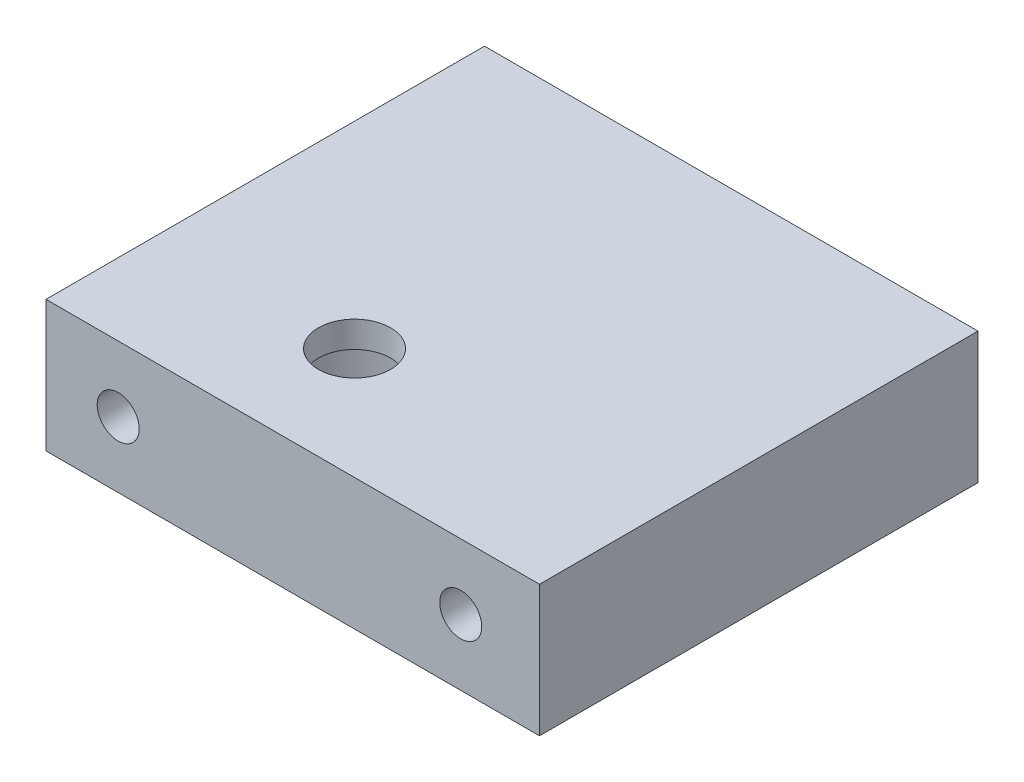
ISO-10303-21;
HEADER;
FILE_DESCRIPTION(('STEP AP214'),'2;1');
FILE_NAME('part.step','',(''),(''),'','','');
FILE_SCHEMA(('AUTOMOTIVE_DESIGN { 1 0 10303 214 1 1 1 1 }'));
ENDSEC;
DATA;
#1=APPLICATION_CONTEXT('core data for automotive mechanical design processes');
#2=APPLICATION_PROTOCOL_DEFINITION('international standard','automotive_design',2000,#1);
#3=PRODUCT_CONTEXT('',#1,'mechanical');
#4=PRODUCT('Part','Part','',(#3));
#5=PRODUCT_RELATED_PRODUCT_CATEGORY('part','',(#4));
#6=PRODUCT_DEFINITION_FORMATION('','',#4);
#7=PRODUCT_DEFINITION_CONTEXT('part definition',#1,'design');
#8=PRODUCT_DEFINITION('design','',#6,#7);
#9=PRODUCT_DEFINITION_SHAPE('','',#8);
#10=(LENGTH_UNIT() NAMED_UNIT(*) SI_UNIT(.MILLI.,.METRE.));
#11=(NAMED_UNIT(*) PLANE_ANGLE_UNIT() SI_UNIT($,.RADIAN.));
#12=(NAMED_UNIT(*) SI_UNIT($,.STERADIAN.) SOLID_ANGLE_UNIT());
#13=UNCERTAINTY_MEASURE_WITH_UNIT(LENGTH_MEASURE(1.E-05),#10,'distance_accuracy_value','');
#14=(GEOMETRIC_REPRESENTATION_CONTEXT(3) GLOBAL_UNCERTAINTY_ASSIGNED_CONTEXT((#13)) GLOBAL_UNIT_ASSIGNED_CONTEXT((#10,
#11,#12)) REPRESENTATION_CONTEXT('',''));
#15=CARTESIAN_POINT('',(0.,0.,0.));
#16=DIRECTION('',(0.,0.,1.));
#17=DIRECTION('',(1.,0.,0.));
#18=AXIS2_PLACEMENT_3D('',#15,#16,#17);
#19=CARTESIAN_POINT('',(6.21136709620178,25.5842182205965,24.9));
#20=DIRECTION('',(0.,-1.,0.));
#21=DIRECTION('',(0.,0.,1.));
#22=AXIS2_PLACEMENT_3D('',#19,#20,#21);
#23=CYLINDRICAL_SURFACE('',#22,6.5);
#24=CARTESIAN_POINT('',(6.21136709620178,15.5842182205965,24.9));
#25=DIRECTION('',(0.,1.,0.));
#26=DIRECTION('',(0.,0.,1.));
#27=AXIS2_PLACEMENT_3D('',#24,#25,#26);
#28=CIRCLE('',#27,6.5);
#29=CARTESIAN_POINT('',(6.21136709620178,15.5842182205965,31.4));
#30=VERTEX_POINT('',#29);
#31=EDGE_CURVE('E113',#30,#30,#28,.T.);
#32=ORIENTED_EDGE('',*,*,#31,.F.);
#33=EDGE_LOOP('',(#32));
#34=FACE_BOUND('',#33,.T.);
#35=CARTESIAN_POINT('',(6.21136709620178,23.5842182205965,24.9));
#36=DIRECTION('',(0.,-1.,0.));
#37=DIRECTION('',(0.,0.,-1.));
#38=AXIS2_PLACEMENT_3D('',#35,#36,#37);
#39=CIRCLE('',#38,6.5);
#40=CARTESIAN_POINT('',(6.21136709620178,23.5842182205965,18.4));
#41=VERTEX_POINT('',#40);
#42=EDGE_CURVE('E11',#41,#41,#39,.F.);
#43=ORIENTED_EDGE('',*,*,#42,.T.);
#44=EDGE_LOOP('',(#43));
#45=FACE_BOUND('',#44,.T.);
#46=ADVANCED_FACE('F41',(#34,#45),#23,.F.);
#47=CARTESIAN_POINT('',(-8.78863290379822,15.5842182205965,33.4));
#48=DIRECTION('',(1.,0.,0.));
#49=DIRECTION('',(0.,0.,-1.));
#50=AXIS2_PLACEMENT_3D('',#47,#48,#49);
#51=PLANE('',#50);
#52=DIRECTION('',(0.,1.,0.));
#53=VECTOR('',#52,1.);
#54=CARTESIAN_POINT('',(-8.78863290379822,15.5842182205965,0.));
#55=LINE('',#54,#53);
#56=CARTESIAN_POINT('',(-8.78863290379822,15.5842182205965,0.));
#57=VERTEX_POINT('',#56);
#58=CARTESIAN_POINT('',(-8.78863290379822,25.5842182205965,0.));
#59=VERTEX_POINT('',#58);
#60=EDGE_CURVE('E110',#57,#59,#55,.T.);
#61=ORIENTED_EDGE('',*,*,#60,.F.);
#62=DIRECTION('',(0.,0.,-1.));
#63=VECTOR('',#62,1.);
#64=CARTESIAN_POINT('',(-8.78863290379822,15.5842182205965,33.4));
#65=LINE('',#64,#63);
#66=CARTESIAN_POINT('',(-8.78863290379822,15.5842182205965,33.4));
#67=VERTEX_POINT('',#66);
#68=EDGE_CURVE('E109',#67,#57,#65,.T.);
#69=ORIENTED_EDGE('',*,*,#68,.F.);
#70=DIRECTION('',(0.,1.,0.));
#71=VECTOR('',#70,1.);
#72=CARTESIAN_POINT('',(-8.78863290379822,15.5842182205965,33.4));
#73=LINE('',#72,#71);
#74=CARTESIAN_POINT('',(-8.78863290379822,25.5842182205965,33.4));
#75=VERTEX_POINT('',#74);
#76=EDGE_CURVE('E103',#67,#75,#73,.T.);
#77=ORIENTED_EDGE('',*,*,#76,.T.);
#78=DIRECTION('',(0.,0.,-1.));
#79=VECTOR('',#78,1.);
#80=CARTESIAN_POINT('',(-8.78863290379822,25.5842182205965,33.4));
#81=LINE('',#80,#79);
#82=EDGE_CURVE('E50',#75,#59,#81,.T.);
#83=ORIENTED_EDGE('',*,*,#82,.T.);
#84=EDGE_LOOP('',(#61,#69,#77,#83));
#85=FACE_BOUND('',#84,.T.);
#86=ADVANCED_FACE('F43',(#85),#51,.F.);
#87=CARTESIAN_POINT('',(-8.78863290379822,25.5842182205965,33.4));
#88=DIRECTION('',(0.,-1.,0.));
#89=DIRECTION('',(0.,0.,1.));
#90=AXIS2_PLACEMENT_3D('',#87,#88,#89);
#91=PLANE('',#90);
#92=DIRECTION('',(1.,0.,0.));
#93=VECTOR('',#92,1.);
#94=CARTESIAN_POINT('',(-8.78863290379822,25.5842182205965,0.));
#95=LINE('',#94,#93);
#96=CARTESIAN_POINT('',(28.8006489733732,25.5842182205965,0.));
#97=VERTEX_POINT('',#96);
#98=EDGE_CURVE('E112',#59,#97,#95,.T.);
#99=ORIENTED_EDGE('',*,*,#98,.F.);
#100=ORIENTED_EDGE('',*,*,#82,.F.);
#101=DIRECTION('',(1.,0.,0.));
#102=VECTOR('',#101,1.);
#103=CARTESIAN_POINT('',(-8.78863290379822,25.5842182205965,33.4));
#104=LINE('',#103,#102);
#105=CARTESIAN_POINT('',(28.8006489733732,25.5842182205965,33.4));
#106=VERTEX_POINT('',#105);
#107=EDGE_CURVE('E83',#75,#106,#104,.T.);
#108=ORIENTED_EDGE('',*,*,#107,.T.);
#109=DIRECTION('',(0.,0.,-1.));
#110=VECTOR('',#109,1.);
#111=CARTESIAN_POINT('',(28.8006489733732,25.5842182205965,33.4));
#112=LINE('',#111,#110);
#113=EDGE_CURVE('E92',#106,#97,#112,.T.);
#114=ORIENTED_EDGE('',*,*,#113,.T.);
#115=EDGE_LOOP('',(#99,#100,#108,#114));
#116=FACE_BOUND('',#115,.T.);
#117=CARTESIAN_POINT('',(6.21136709620178,25.5842182205965,24.8999999999992));
#118=DIRECTION('',(0.,-1.,0.));
#119=DIRECTION('',(0.,0.,-1.));
#120=AXIS2_PLACEMENT_3D('',#117,#118,#119);
#121=CIRCLE('',#120,2.75);
#122=CARTESIAN_POINT('',(6.21136709620178,25.5842182205965,22.1499999999992));
#123=VERTEX_POINT('',#122);
#124=EDGE_CURVE('E137',#123,#123,#121,.T.);
#125=ORIENTED_EDGE('',*,*,#124,.T.);
#126=EDGE_LOOP('',(#125));
#127=FACE_BOUND('',#126,.T.);
#128=ADVANCED_FACE('F99',(#116,#127),#91,.F.);
#129=CARTESIAN_POINT('',(28.8006489733732,15.5842182205965,33.4));
#130=DIRECTION('',(1.,0.,0.));
#131=DIRECTION('',(0.,0.,-1.));
#132=AXIS2_PLACEMENT_3D('',#129,#130,#131);
#133=PLANE('',#132);
#134=DIRECTION('',(0.,1.,0.));
#135=VECTOR('',#134,1.);
#136=CARTESIAN_POINT('',(28.8006489733732,15.5842182205965,0.));
#137=LINE('',#136,#135);
#138=CARTESIAN_POINT('',(28.8006489733732,15.5842182205965,0.));
#139=VERTEX_POINT('',#138);
#140=EDGE_CURVE('E94',#139,#97,#137,.T.);
#141=ORIENTED_EDGE('',*,*,#140,.T.);
#142=ORIENTED_EDGE('',*,*,#113,.F.);
#143=DIRECTION('',(0.,1.,0.));
#144=VECTOR('',#143,1.);
#145=CARTESIAN_POINT('',(28.8006489733732,15.5842182205965,33.4));
#146=LINE('',#145,#144);
#147=CARTESIAN_POINT('',(28.8006489733732,15.5842182205965,33.4));
#148=VERTEX_POINT('',#147);
#149=EDGE_CURVE('E86',#148,#106,#146,.T.);
#150=ORIENTED_EDGE('',*,*,#149,.F.);
#151=DIRECTION('',(0.,0.,-1.));
#152=VECTOR('',#151,1.);
#153=CARTESIAN_POINT('',(28.8006489733732,15.5842182205965,33.4));
#154=LINE('',#153,#152);
#155=EDGE_CURVE('E97',#148,#139,#154,.T.);
#156=ORIENTED_EDGE('',*,*,#155,.T.);
#157=EDGE_LOOP('',(#141,#142,#150,#156));
#158=FACE_BOUND('',#157,.T.);
#159=ADVANCED_FACE('F93',(#158),#133,.T.);
#160=CARTESIAN_POINT('',(-8.78863290379822,15.5842182205965,33.4));
#161=DIRECTION('',(0.,-1.,0.));
#162=DIRECTION('',(0.,0.,1.));
#163=AXIS2_PLACEMENT_3D('',#160,#161,#162);
#164=PLANE('',#163);
#165=ORIENTED_EDGE('',*,*,#31,.T.);
#166=EDGE_LOOP('',(#165));
#167=FACE_BOUND('',#166,.T.);
#168=DIRECTION('',(1.,0.,0.));
#169=VECTOR('',#168,1.);
#170=CARTESIAN_POINT('',(-8.78863290379822,15.5842182205965,0.));
#171=LINE('',#170,#169);
#172=EDGE_CURVE('E72',#57,#139,#171,.T.);
#173=ORIENTED_EDGE('',*,*,#172,.T.);
#174=ORIENTED_EDGE('',*,*,#155,.F.);
#175=DIRECTION('',(1.,0.,0.));
#176=VECTOR('',#175,1.);
#177=CARTESIAN_POINT('',(-8.78863290379822,15.5842182205965,33.4));
#178=LINE('',#177,#176);
#179=EDGE_CURVE('E58',#67,#148,#178,.T.);
#180=ORIENTED_EDGE('',*,*,#179,.F.);
#181=ORIENTED_EDGE('',*,*,#68,.T.);
#182=EDGE_LOOP('',(#173,#174,#180,#181));
#183=FACE_BOUND('',#182,.T.);
#184=ADVANCED_FACE('F167',(#167,#183),#164,.T.);
#185=CARTESIAN_POINT('',(0.,31.1684364411929,33.4));
#186=DIRECTION('',(0.,0.,1.));
#187=DIRECTION('',(1.,0.,0.));
#188=AXIS2_PLACEMENT_3D('',#185,#186,#187);
#189=PLANE('',#188);
#190=CARTESIAN_POINT('',(-3.28863290379822,20.5842182205965,33.4));
#191=DIRECTION('',(0.,0.,-1.));
#192=DIRECTION('',(1.,0.,0.));
#193=AXIS2_PLACEMENT_3D('',#190,#191,#192);
#194=CIRCLE('',#193,1.6);
#195=CARTESIAN_POINT('',(-1.68863290379822,20.5842182205965,33.4));
#196=VERTEX_POINT('',#195);
#197=EDGE_CURVE('E123',#196,#196,#194,.T.);
#198=ORIENTED_EDGE('',*,*,#197,.T.);
#199=EDGE_LOOP('',(#198));
#200=FACE_BOUND('',#199,.T.);
#201=CARTESIAN_POINT('',(22.8006489733732,20.5842182205965,33.4));
#202=DIRECTION('',(0.,0.,-1.));
#203=DIRECTION('',(1.,0.,0.));
#204=AXIS2_PLACEMENT_3D('',#201,#202,#203);
#205=CIRCLE('',#204,1.6);
#206=CARTESIAN_POINT('',(24.4006489733732,20.5842182205965,33.4));
#207=VERTEX_POINT('',#206);
#208=EDGE_CURVE('E131',#207,#207,#205,.T.);
#209=ORIENTED_EDGE('',*,*,#208,.T.);
#210=EDGE_LOOP('',(#209));
#211=FACE_BOUND('',#210,.T.);
#212=ORIENTED_EDGE('',*,*,#76,.F.);
#213=ORIENTED_EDGE('',*,*,#179,.T.);
#214=ORIENTED_EDGE('',*,*,#149,.T.);
#215=ORIENTED_EDGE('',*,*,#107,.F.);
#216=EDGE_LOOP('',(#212,#213,#214,#215));
#217=FACE_BOUND('',#216,.T.);
#218=ADVANCED_FACE('F88',(#200,#211,#217),#189,.T.);
#219=CARTESIAN_POINT('',(0.,31.1684364411929,0.));
#220=DIRECTION('',(0.,0.,1.));
#221=DIRECTION('',(1.,0.,0.));
#222=AXIS2_PLACEMENT_3D('',#219,#220,#221);
#223=PLANE('',#222);
#224=CARTESIAN_POINT('',(-3.28863290379822,20.5842182205965,0.));
#225=DIRECTION('',(0.,0.,-1.));
#226=DIRECTION('',(1.,0.,0.));
#227=AXIS2_PLACEMENT_3D('',#224,#225,#226);
#228=CIRCLE('',#227,1.6);
#229=CARTESIAN_POINT('',(-1.68863290379822,20.5842182205965,0.));
#230=VERTEX_POINT('',#229);
#231=EDGE_CURVE('E122',#230,#230,#228,.T.);
#232=ORIENTED_EDGE('',*,*,#231,.F.);
#233=EDGE_LOOP('',(#232));
#234=FACE_BOUND('',#233,.T.);
#235=CARTESIAN_POINT('',(22.8006489733732,20.5842182205965,0.));
#236=DIRECTION('',(0.,0.,-1.));
#237=DIRECTION('',(1.,0.,0.));
#238=AXIS2_PLACEMENT_3D('',#235,#236,#237);
#239=CIRCLE('',#238,1.6);
#240=CARTESIAN_POINT('',(24.4006489733732,20.5842182205965,0.));
#241=VERTEX_POINT('',#240);
#242=EDGE_CURVE('E120',#241,#241,#239,.T.);
#243=ORIENTED_EDGE('',*,*,#242,.F.);
#244=EDGE_LOOP('',(#243));
#245=FACE_BOUND('',#244,.T.);
#246=ORIENTED_EDGE('',*,*,#60,.T.);
#247=ORIENTED_EDGE('',*,*,#98,.T.);
#248=ORIENTED_EDGE('',*,*,#140,.F.);
#249=ORIENTED_EDGE('',*,*,#172,.F.);
#250=EDGE_LOOP('',(#246,#247,#248,#249));
#251=FACE_BOUND('',#250,.T.);
#252=ADVANCED_FACE('F166',(#234,#245,#251),#223,.F.);
#253=CARTESIAN_POINT('',(22.8006489733732,20.5842182205965,-16.6));
#254=DIRECTION('',(0.,0.,1.));
#255=DIRECTION('',(1.,0.,0.));
#256=AXIS2_PLACEMENT_3D('',#253,#254,#255);
#257=CYLINDRICAL_SURFACE('',#256,1.6);
#258=ORIENTED_EDGE('',*,*,#208,.F.);
#259=EDGE_LOOP('',(#258));
#260=FACE_BOUND('',#259,.T.);
#261=ORIENTED_EDGE('',*,*,#242,.T.);
#262=EDGE_LOOP('',(#261));
#263=FACE_BOUND('',#262,.T.);
#264=ADVANCED_FACE('F162',(#260,#263),#257,.F.);
#265=CARTESIAN_POINT('',(-3.28863290379822,20.5842182205965,-16.6));
#266=DIRECTION('',(0.,0.,1.));
#267=DIRECTION('',(1.,0.,0.));
#268=AXIS2_PLACEMENT_3D('',#265,#266,#267);
#269=CYLINDRICAL_SURFACE('',#268,1.6);
#270=ORIENTED_EDGE('',*,*,#197,.F.);
#271=EDGE_LOOP('',(#270));
#272=FACE_BOUND('',#271,.T.);
#273=ORIENTED_EDGE('',*,*,#231,.T.);
#274=EDGE_LOOP('',(#273));
#275=FACE_BOUND('',#274,.T.);
#276=ADVANCED_FACE('F149',(#272,#275),#269,.F.);
#277=CARTESIAN_POINT('',(6.21136709620178,23.5842182205965,24.8999999999992));
#278=DIRECTION('',(0.,1.,0.));
#279=DIRECTION('',(0.,0.,-1.));
#280=AXIS2_PLACEMENT_3D('',#277,#278,#279);
#281=PLANE('',#280);
#282=CARTESIAN_POINT('',(6.21136709620178,23.5842182205965,24.8999999999992));
#283=DIRECTION('',(0.,-1.,0.));
#284=DIRECTION('',(0.,0.,-1.));
#285=AXIS2_PLACEMENT_3D('',#282,#283,#284);
#286=CIRCLE('',#285,2.75);
#287=CARTESIAN_POINT('',(6.21136709620178,23.5842182205965,22.1499999999992));
#288=VERTEX_POINT('',#287);
#289=EDGE_CURVE('E134',#288,#288,#286,.T.);
#290=ORIENTED_EDGE('',*,*,#289,.F.);
#291=EDGE_LOOP('',(#290));
#292=FACE_BOUND('',#291,.T.);
#293=ORIENTED_EDGE('',*,*,#42,.F.);
#294=EDGE_LOOP('',(#293));
#295=FACE_BOUND('',#294,.T.);
#296=ADVANCED_FACE('F146',(#292,#295),#281,.F.);
#297=CARTESIAN_POINT('',(6.21136709620178,23.5842182205965,24.8999999999992));
#298=DIRECTION('',(0.,1.,0.));
#299=DIRECTION('',(0.,0.,-1.));
#300=AXIS2_PLACEMENT_3D('',#297,#298,#299);
#301=CYLINDRICAL_SURFACE('',#300,2.75);
#302=ORIENTED_EDGE('',*,*,#289,.T.);
#303=EDGE_LOOP('',(#302));
#304=FACE_BOUND('',#303,.T.);
#305=ORIENTED_EDGE('',*,*,#124,.F.);
#306=EDGE_LOOP('',(#305));
#307=FACE_BOUND('',#306,.T.);
#308=ADVANCED_FACE('F143',(#304,#307),#301,.F.);
#309=CLOSED_SHELL('',(#46,#86,#128,#159,#184,#218,#252,#264,#276,#296,#308));
#310=MANIFOLD_SOLID_BREP('B2',#309);
#311=ADVANCED_BREP_SHAPE_REPRESENTATION('',(#18,#310),#14);
#312=SHAPE_DEFINITION_REPRESENTATION(#9,#311);
ENDSEC;
END-ISO-10303-21;
